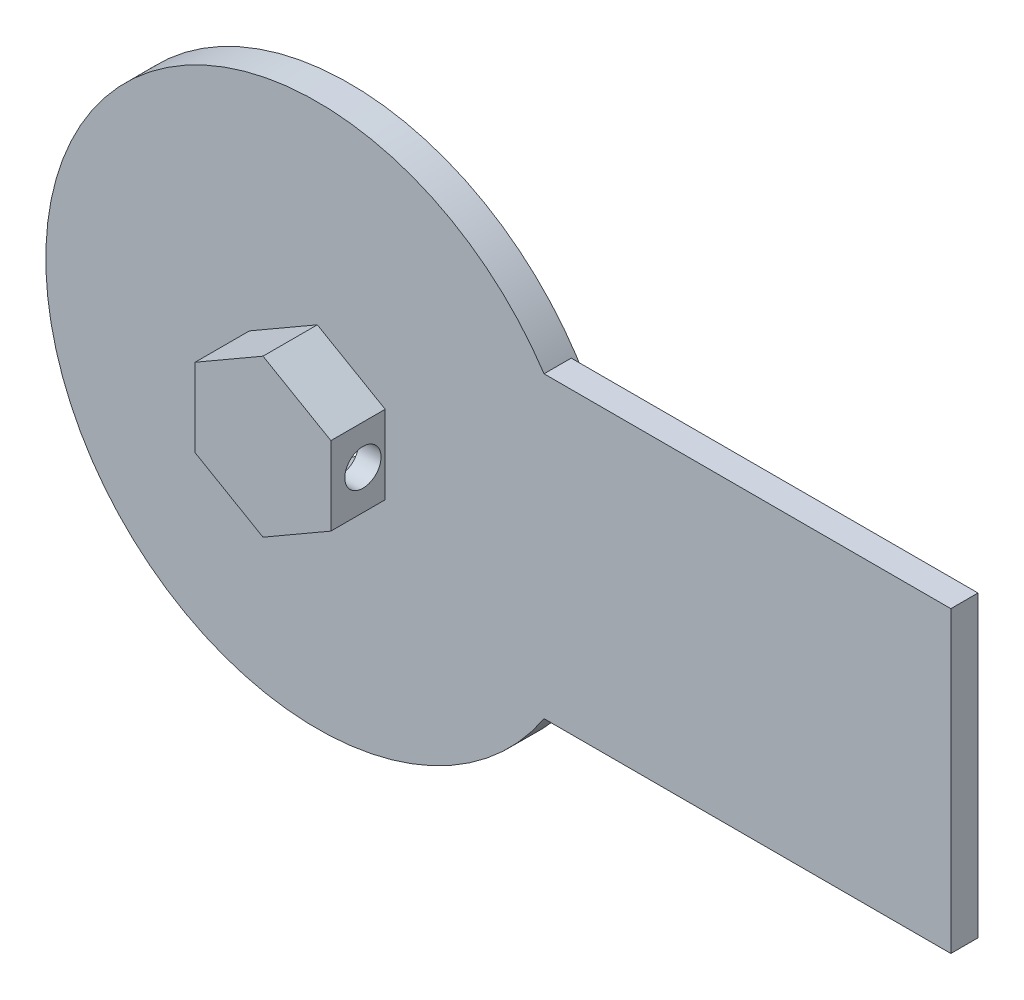
ISO-10303-21;
HEADER;
FILE_DESCRIPTION(('STEP AP214'),'2;1');
FILE_NAME('part.step','',(''),(''),'','','');
FILE_SCHEMA(('AUTOMOTIVE_DESIGN { 1 0 10303 214 1 1 1 1 }'));
ENDSEC;
DATA;
#1=APPLICATION_CONTEXT('core data for automotive mechanical design processes');
#2=APPLICATION_PROTOCOL_DEFINITION('international standard','automotive_design',2000,#1);
#3=PRODUCT_CONTEXT('',#1,'mechanical');
#4=PRODUCT('Part','Part','',(#3));
#5=PRODUCT_RELATED_PRODUCT_CATEGORY('part','',(#4));
#6=PRODUCT_DEFINITION_FORMATION('','',#4);
#7=PRODUCT_DEFINITION_CONTEXT('part definition',#1,'design');
#8=PRODUCT_DEFINITION('design','',#6,#7);
#9=PRODUCT_DEFINITION_SHAPE('','',#8);
#10=(LENGTH_UNIT() NAMED_UNIT(*) SI_UNIT(.MILLI.,.METRE.));
#11=(NAMED_UNIT(*) PLANE_ANGLE_UNIT() SI_UNIT($,.RADIAN.));
#12=(NAMED_UNIT(*) SI_UNIT($,.STERADIAN.) SOLID_ANGLE_UNIT());
#13=UNCERTAINTY_MEASURE_WITH_UNIT(LENGTH_MEASURE(1.E-05),#10,'distance_accuracy_value','');
#14=(GEOMETRIC_REPRESENTATION_CONTEXT(3) GLOBAL_UNCERTAINTY_ASSIGNED_CONTEXT((#13)) GLOBAL_UNIT_ASSIGNED_CONTEXT((#10,
#11,#12)) REPRESENTATION_CONTEXT('',''));
#15=CARTESIAN_POINT('',(0.,0.,0.));
#16=DIRECTION('',(0.,0.,1.));
#17=DIRECTION('',(1.,0.,0.));
#18=AXIS2_PLACEMENT_3D('',#15,#16,#17);
#19=CARTESIAN_POINT('',(-5.00000000000001,2.88675134594821,6.));
#20=DIRECTION('',(-0.499999999999995,0.866025403784441,0.));
#21=DIRECTION('',(-0.866025403784442,-0.499999999999995,0.));
#22=AXIS2_PLACEMENT_3D('',#19,#20,#21);
#23=PLANE('',#22);
#24=DIRECTION('',(-0.866025403784438,-0.500000000000001,0.));
#25=VECTOR('',#24,1.);
#26=CARTESIAN_POINT('',(0.,5.77350269189631,9.14));
#27=LINE('',#26,#25);
#28=CARTESIAN_POINT('',(0.,5.77350269189631,9.14));
#29=VERTEX_POINT('',#28);
#30=CARTESIAN_POINT('',(-5.00000000000001,2.88675134594821,9.14));
#31=VERTEX_POINT('',#30);
#32=EDGE_CURVE('E54',#29,#31,#27,.T.);
#33=ORIENTED_EDGE('',*,*,#32,.T.);
#34=DIRECTION('',(0.,0.,-1.));
#35=VECTOR('',#34,1.);
#36=CARTESIAN_POINT('',(-5.00000000000001,2.88675134594821,6.));
#37=LINE('',#36,#35);
#38=CARTESIAN_POINT('',(-5.00000000000001,2.88675134594821,0.));
#39=VERTEX_POINT('',#38);
#40=EDGE_CURVE('E244',#31,#39,#37,.T.);
#41=ORIENTED_EDGE('',*,*,#40,.T.);
#42=DIRECTION('',(0.866025403784442,0.499999999999995,0.));
#43=VECTOR('',#42,1.);
#44=CARTESIAN_POINT('',(-5.00000000000001,2.88675134594821,0.));
#45=LINE('',#44,#43);
#46=CARTESIAN_POINT('',(0.,5.77350269189631,0.));
#47=VERTEX_POINT('',#46);
#48=EDGE_CURVE('E229',#39,#47,#45,.T.);
#49=ORIENTED_EDGE('',*,*,#48,.T.);
#50=DIRECTION('',(0.,0.,-1.));
#51=VECTOR('',#50,1.);
#52=CARTESIAN_POINT('',(0.,5.77350269189631,6.));
#53=LINE('',#52,#51);
#54=EDGE_CURVE('E163',#29,#47,#53,.T.);
#55=ORIENTED_EDGE('',*,*,#54,.F.);
#56=EDGE_LOOP('',(#33,#41,#49,#55));
#57=FACE_BOUND('',#56,.T.);
#58=ADVANCED_FACE('F39',(#57),#23,.F.);
#59=CARTESIAN_POINT('',(-5.00000000000007,-2.88675134594811,6.));
#60=DIRECTION('',(-1.,0.,0.));
#61=DIRECTION('',(0.,-1.,0.));
#62=AXIS2_PLACEMENT_3D('',#59,#60,#61);
#63=PLANE('',#62);
#64=DIRECTION('',(0.,-1.,0.));
#65=VECTOR('',#64,1.);
#66=CARTESIAN_POINT('',(-5.00000000000005,2.88675134594814,9.14));
#67=LINE('',#66,#65);
#68=CARTESIAN_POINT('',(-5.00000000000007,-2.88675134594811,9.14));
#69=VERTEX_POINT('',#68);
#70=EDGE_CURVE('E61',#31,#69,#67,.T.);
#71=ORIENTED_EDGE('',*,*,#70,.T.);
#72=DIRECTION('',(0.,0.,-1.));
#73=VECTOR('',#72,1.);
#74=CARTESIAN_POINT('',(-5.00000000000007,-2.88675134594811,6.));
#75=LINE('',#74,#73);
#76=CARTESIAN_POINT('',(-5.00000000000007,-2.88675134594811,0.));
#77=VERTEX_POINT('',#76);
#78=EDGE_CURVE('E247',#69,#77,#75,.T.);
#79=ORIENTED_EDGE('',*,*,#78,.T.);
#80=DIRECTION('',(0.,1.,0.));
#81=VECTOR('',#80,1.);
#82=CARTESIAN_POINT('',(-5.00000000000007,-2.88675134594811,0.));
#83=LINE('',#82,#81);
#84=EDGE_CURVE('E241',#77,#39,#83,.T.);
#85=ORIENTED_EDGE('',*,*,#84,.T.);
#86=ORIENTED_EDGE('',*,*,#40,.F.);
#87=EDGE_LOOP('',(#71,#79,#85,#86));
#88=FACE_BOUND('',#87,.T.);
#89=ADVANCED_FACE('F311',(#88),#63,.F.);
#90=CARTESIAN_POINT('',(0.,-5.77350269189631,6.));
#91=DIRECTION('',(-0.500000000000007,-0.866025403784435,0.));
#92=DIRECTION('',(0.866025403784435,-0.500000000000007,0.));
#93=AXIS2_PLACEMENT_3D('',#90,#91,#92);
#94=PLANE('',#93);
#95=DIRECTION('',(0.866025403784442,-0.499999999999995,0.));
#96=VECTOR('',#95,1.);
#97=CARTESIAN_POINT('',(-5.00000000000003,-2.88675134594818,9.14));
#98=LINE('',#97,#96);
#99=CARTESIAN_POINT('',(0.,-5.77350269189631,9.14));
#100=VERTEX_POINT('',#99);
#101=EDGE_CURVE('E184',#69,#100,#98,.T.);
#102=ORIENTED_EDGE('',*,*,#101,.T.);
#103=DIRECTION('',(0.,0.,-1.));
#104=VECTOR('',#103,1.);
#105=CARTESIAN_POINT('',(0.,-5.77350269189631,6.));
#106=LINE('',#105,#104);
#107=CARTESIAN_POINT('',(0.,-5.77350269189631,0.));
#108=VERTEX_POINT('',#107);
#109=EDGE_CURVE('E249',#100,#108,#106,.T.);
#110=ORIENTED_EDGE('',*,*,#109,.T.);
#111=DIRECTION('',(-0.866025403784435,0.500000000000007,0.));
#112=VECTOR('',#111,1.);
#113=CARTESIAN_POINT('',(0.,-5.77350269189631,0.));
#114=LINE('',#113,#112);
#115=EDGE_CURVE('E238',#108,#77,#114,.T.);
#116=ORIENTED_EDGE('',*,*,#115,.T.);
#117=ORIENTED_EDGE('',*,*,#78,.F.);
#118=EDGE_LOOP('',(#102,#110,#116,#117));
#119=FACE_BOUND('',#118,.T.);
#120=ADVANCED_FACE('F316',(#119),#94,.F.);
#121=CARTESIAN_POINT('',(5.00000000000003,-2.88675134594818,6.));
#122=DIRECTION('',(0.499999999999995,-0.866025403784441,0.));
#123=DIRECTION('',(0.866025403784442,0.499999999999995,0.));
#124=AXIS2_PLACEMENT_3D('',#121,#122,#123);
#125=PLANE('',#124);
#126=DIRECTION('',(0.866025403784435,0.500000000000007,0.));
#127=VECTOR('',#126,1.);
#128=CARTESIAN_POINT('',(0.,-5.77350269189631,9.14));
#129=LINE('',#128,#127);
#130=CARTESIAN_POINT('',(5.00000000000003,-2.88675134594818,9.14));
#131=VERTEX_POINT('',#130);
#132=EDGE_CURVE('E172',#100,#131,#129,.T.);
#133=ORIENTED_EDGE('',*,*,#132,.T.);
#134=DIRECTION('',(0.,0.,-1.));
#135=VECTOR('',#134,1.);
#136=CARTESIAN_POINT('',(5.00000000000003,-2.88675134594818,6.));
#137=LINE('',#136,#135);
#138=CARTESIAN_POINT('',(5.00000000000003,-2.88675134594818,0.));
#139=VERTEX_POINT('',#138);
#140=EDGE_CURVE('E162',#131,#139,#137,.T.);
#141=ORIENTED_EDGE('',*,*,#140,.T.);
#142=DIRECTION('',(-0.866025403784442,-0.499999999999995,0.));
#143=VECTOR('',#142,1.);
#144=CARTESIAN_POINT('',(5.00000000000003,-2.88675134594818,0.));
#145=LINE('',#144,#143);
#146=EDGE_CURVE('E235',#139,#108,#145,.T.);
#147=ORIENTED_EDGE('',*,*,#146,.T.);
#148=ORIENTED_EDGE('',*,*,#109,.F.);
#149=EDGE_LOOP('',(#133,#141,#147,#148));
#150=FACE_BOUND('',#149,.T.);
#151=ADVANCED_FACE('F359',(#150),#125,.F.);
#152=CARTESIAN_POINT('',(5.00000000000005,2.88675134594814,6.));
#153=DIRECTION('',(1.,0.,0.));
#154=DIRECTION('',(0.,1.,0.));
#155=AXIS2_PLACEMENT_3D('',#152,#153,#154);
#156=PLANE('',#155);
#157=CARTESIAN_POINT('',(5.00000000000004,0.,6.));
#158=DIRECTION('',(1.,0.,0.));
#159=DIRECTION('',(0.,1.,0.));
#160=AXIS2_PLACEMENT_3D('',#157,#158,#159);
#161=CIRCLE('',#160,2.);
#162=CARTESIAN_POINT('',(5.00000000000005,2.,6.));
#163=VERTEX_POINT('',#162);
#164=EDGE_CURVE('E175',#163,#163,#161,.F.);
#165=ORIENTED_EDGE('',*,*,#164,.F.);
#166=EDGE_LOOP('',(#165));
#167=FACE_BOUND('',#166,.T.);
#168=DIRECTION('',(0.,1.,0.));
#169=VECTOR('',#168,1.);
#170=CARTESIAN_POINT('',(5.00000000000007,-2.88675134594811,9.14));
#171=LINE('',#170,#169);
#172=CARTESIAN_POINT('',(5.00000000000001,2.88675134594821,9.14));
#173=VERTEX_POINT('',#172);
#174=EDGE_CURVE('E167',#131,#173,#171,.T.);
#175=ORIENTED_EDGE('',*,*,#174,.T.);
#176=DIRECTION('',(0.,0.,-1.));
#177=VECTOR('',#176,1.);
#178=CARTESIAN_POINT('',(5.00000000000005,2.88675134594814,6.));
#179=LINE('',#178,#177);
#180=CARTESIAN_POINT('',(5.00000000000005,2.88675134594814,0.));
#181=VERTEX_POINT('',#180);
#182=EDGE_CURVE('E152',#173,#181,#179,.T.);
#183=ORIENTED_EDGE('',*,*,#182,.T.);
#184=DIRECTION('',(0.,-1.,0.));
#185=VECTOR('',#184,1.);
#186=CARTESIAN_POINT('',(5.00000000000005,2.88675134594814,0.));
#187=LINE('',#186,#185);
#188=EDGE_CURVE('E233',#181,#139,#187,.T.);
#189=ORIENTED_EDGE('',*,*,#188,.T.);
#190=ORIENTED_EDGE('',*,*,#140,.F.);
#191=EDGE_LOOP('',(#175,#183,#189,#190));
#192=FACE_BOUND('',#191,.T.);
#193=ADVANCED_FACE('F168',(#167,#192),#156,.F.);
#194=CARTESIAN_POINT('',(0.,5.77350269189631,6.));
#195=DIRECTION('',(0.500000000000001,0.866025403784438,0.));
#196=DIRECTION('',(-0.866025403784438,0.500000000000001,0.));
#197=AXIS2_PLACEMENT_3D('',#194,#195,#196);
#198=PLANE('',#197);
#199=DIRECTION('',(-0.866025403784442,0.499999999999995,0.));
#200=VECTOR('',#199,1.);
#201=CARTESIAN_POINT('',(5.00000000000001,2.88675134594821,9.14));
#202=LINE('',#201,#200);
#203=EDGE_CURVE('E156',#173,#29,#202,.T.);
#204=ORIENTED_EDGE('',*,*,#203,.T.);
#205=ORIENTED_EDGE('',*,*,#54,.T.);
#206=DIRECTION('',(0.866025403784438,-0.500000000000001,0.));
#207=VECTOR('',#206,1.);
#208=CARTESIAN_POINT('',(0.,5.77350269189631,0.));
#209=LINE('',#208,#207);
#210=EDGE_CURVE('E158',#47,#181,#209,.T.);
#211=ORIENTED_EDGE('',*,*,#210,.T.);
#212=ORIENTED_EDGE('',*,*,#182,.F.);
#213=EDGE_LOOP('',(#204,#205,#211,#212));
#214=FACE_BOUND('',#213,.T.);
#215=ADVANCED_FACE('F154',(#214),#198,.F.);
#216=CARTESIAN_POINT('',(0.,0.,3.54));
#217=DIRECTION('',(0.,0.,1.));
#218=DIRECTION('',(1.,0.,0.));
#219=AXIS2_PLACEMENT_3D('',#216,#217,#218);
#220=PLANE('',#219);
#221=CARTESIAN_POINT('',(0.,0.,3.54));
#222=DIRECTION('',(0.,0.,1.));
#223=DIRECTION('',(1.,0.,0.));
#224=AXIS2_PLACEMENT_3D('',#221,#222,#223);
#225=CIRCLE('',#224,30.);
#226=CARTESIAN_POINT('',(25.0549396327351,16.5,3.54));
#227=VERTEX_POINT('',#226);
#228=CARTESIAN_POINT('',(25.0549396327351,-16.5,3.54));
#229=VERTEX_POINT('',#228);
#230=EDGE_CURVE('E11',#227,#229,#225,.T.);
#231=ORIENTED_EDGE('',*,*,#230,.T.);
#232=DIRECTION('',(1.,0.,0.));
#233=VECTOR('',#232,1.);
#234=CARTESIAN_POINT('',(25.0549396327351,-16.5,3.54));
#235=LINE('',#234,#233);
#236=CARTESIAN_POINT('',(70.,-16.5,3.54));
#237=VERTEX_POINT('',#236);
#238=EDGE_CURVE('E246',#229,#237,#235,.T.);
#239=ORIENTED_EDGE('',*,*,#238,.T.);
#240=DIRECTION('',(0.,1.,0.));
#241=VECTOR('',#240,1.);
#242=CARTESIAN_POINT('',(70.,16.5,3.54));
#243=LINE('',#242,#241);
#244=CARTESIAN_POINT('',(70.,16.5,3.54));
#245=VERTEX_POINT('',#244);
#246=EDGE_CURVE('E269',#237,#245,#243,.T.);
#247=ORIENTED_EDGE('',*,*,#246,.T.);
#248=DIRECTION('',(-1.,0.,0.));
#249=VECTOR('',#248,1.);
#250=CARTESIAN_POINT('',(25.0549396327351,16.5,3.54));
#251=LINE('',#250,#249);
#252=EDGE_CURVE('E257',#245,#227,#251,.T.);
#253=ORIENTED_EDGE('',*,*,#252,.T.);
#254=EDGE_LOOP('',(#231,#239,#247,#253));
#255=FACE_BOUND('',#254,.T.);
#256=DIRECTION('',(-0.866025403784438,-0.5,0.));
#257=VECTOR('',#256,1.);
#258=CARTESIAN_POINT('',(0.,8.66025403784439,3.54));
#259=LINE('',#258,#257);
#260=CARTESIAN_POINT('',(0.,8.66025403784439,3.54));
#261=VERTEX_POINT('',#260);
#262=CARTESIAN_POINT('',(-7.5,4.33012701892219,3.54));
#263=VERTEX_POINT('',#262);
#264=EDGE_CURVE('E204',#261,#263,#259,.T.);
#265=ORIENTED_EDGE('',*,*,#264,.F.);
#266=DIRECTION('',(-0.866025403784439,0.5,0.));
#267=VECTOR('',#266,1.);
#268=CARTESIAN_POINT('',(7.5,4.3301270189222,3.54));
#269=LINE('',#268,#267);
#270=CARTESIAN_POINT('',(7.5,4.3301270189222,3.54));
#271=VERTEX_POINT('',#270);
#272=EDGE_CURVE('E171',#271,#261,#269,.T.);
#273=ORIENTED_EDGE('',*,*,#272,.F.);
#274=DIRECTION('',(0.,1.,0.));
#275=VECTOR('',#274,1.);
#276=CARTESIAN_POINT('',(7.5,-4.33012701892219,3.54));
#277=LINE('',#276,#275);
#278=CARTESIAN_POINT('',(7.5,-4.33012701892219,3.54));
#279=VERTEX_POINT('',#278);
#280=EDGE_CURVE('E191',#279,#271,#277,.T.);
#281=ORIENTED_EDGE('',*,*,#280,.F.);
#282=DIRECTION('',(0.866025403784439,0.5,0.));
#283=VECTOR('',#282,1.);
#284=CARTESIAN_POINT('',(0.,-8.66025403784439,3.54));
#285=LINE('',#284,#283);
#286=CARTESIAN_POINT('',(0.,-8.66025403784439,3.54));
#287=VERTEX_POINT('',#286);
#288=EDGE_CURVE('E210',#287,#279,#285,.T.);
#289=ORIENTED_EDGE('',*,*,#288,.F.);
#290=DIRECTION('',(0.866025403784439,-0.5,0.));
#291=VECTOR('',#290,1.);
#292=CARTESIAN_POINT('',(-7.50000000000001,-4.33012701892219,3.54));
#293=LINE('',#292,#291);
#294=CARTESIAN_POINT('',(-7.50000000000001,-4.33012701892219,3.54));
#295=VERTEX_POINT('',#294);
#296=EDGE_CURVE('E208',#295,#287,#293,.T.);
#297=ORIENTED_EDGE('',*,*,#296,.F.);
#298=DIRECTION('',(0.,-1.,0.));
#299=VECTOR('',#298,1.);
#300=CARTESIAN_POINT('',(-7.5,4.33012701892219,3.54));
#301=LINE('',#300,#299);
#302=EDGE_CURVE('E206',#263,#295,#301,.T.);
#303=ORIENTED_EDGE('',*,*,#302,.F.);
#304=EDGE_LOOP('',(#265,#273,#281,#289,#297,#303));
#305=FACE_BOUND('',#304,.T.);
#306=ADVANCED_FACE('F288',(#255,#305),#220,.T.);
#307=CARTESIAN_POINT('',(0.,0.,3.54));
#308=DIRECTION('',(0.,0.,-1.));
#309=DIRECTION('',(-1.,0.,0.));
#310=AXIS2_PLACEMENT_3D('',#307,#308,#309);
#311=CYLINDRICAL_SURFACE('',#310,30.);
#312=ORIENTED_EDGE('',*,*,#230,.F.);
#313=DIRECTION('',(0.,0.,1.));
#314=VECTOR('',#313,1.);
#315=CARTESIAN_POINT('',(25.0549396327351,16.5,0.54));
#316=LINE('',#315,#314);
#317=CARTESIAN_POINT('',(25.0549396327351,16.5,0.54));
#318=VERTEX_POINT('',#317);
#319=EDGE_CURVE('E273',#318,#227,#316,.T.);
#320=ORIENTED_EDGE('',*,*,#319,.F.);
#321=CARTESIAN_POINT('',(-2.74086309204336E-13,0.,0.54));
#322=DIRECTION('',(0.,0.,-1.));
#323=DIRECTION('',(-1.,0.,0.));
#324=AXIS2_PLACEMENT_3D('',#321,#322,#323);
#325=CIRCLE('',#324,30.0000000000002);
#326=CARTESIAN_POINT('',(25.0549396327351,-16.5,0.54));
#327=VERTEX_POINT('',#326);
#328=EDGE_CURVE('E253',#318,#327,#325,.T.);
#329=ORIENTED_EDGE('',*,*,#328,.T.);
#330=DIRECTION('',(0.,0.,1.));
#331=VECTOR('',#330,1.);
#332=CARTESIAN_POINT('',(25.0549396327351,-16.5,0.54));
#333=LINE('',#332,#331);
#334=EDGE_CURVE('E266',#327,#229,#333,.T.);
#335=ORIENTED_EDGE('',*,*,#334,.T.);
#336=EDGE_LOOP('',(#312,#320,#329,#335));
#337=FACE_BOUND('',#336,.T.);
#338=CARTESIAN_POINT('',(0.,0.,0.));
#339=DIRECTION('',(0.,0.,1.));
#340=DIRECTION('',(1.,0.,0.));
#341=AXIS2_PLACEMENT_3D('',#338,#339,#340);
#342=CIRCLE('',#341,30.);
#343=CARTESIAN_POINT('',(30.,0.,0.));
#344=VERTEX_POINT('',#343);
#345=EDGE_CURVE('E43',#344,#344,#342,.T.);
#346=ORIENTED_EDGE('',*,*,#345,.T.);
#347=EDGE_LOOP('',(#346));
#348=FACE_BOUND('',#347,.T.);
#349=ADVANCED_FACE('F41',(#337,#348),#311,.T.);
#350=CARTESIAN_POINT('',(0.,0.,0.));
#351=DIRECTION('',(0.,0.,1.));
#352=DIRECTION('',(1.,0.,0.));
#353=AXIS2_PLACEMENT_3D('',#350,#351,#352);
#354=PLANE('',#353);
#355=ORIENTED_EDGE('',*,*,#210,.F.);
#356=ORIENTED_EDGE('',*,*,#48,.F.);
#357=ORIENTED_EDGE('',*,*,#84,.F.);
#358=ORIENTED_EDGE('',*,*,#115,.F.);
#359=ORIENTED_EDGE('',*,*,#146,.F.);
#360=ORIENTED_EDGE('',*,*,#188,.F.);
#361=EDGE_LOOP('',(#355,#356,#357,#358,#359,#360));
#362=FACE_BOUND('',#361,.T.);
#363=ORIENTED_EDGE('',*,*,#345,.F.);
#364=EDGE_LOOP('',(#363));
#365=FACE_BOUND('',#364,.T.);
#366=ADVANCED_FACE('F308',(#362,#365),#354,.F.);
#367=CARTESIAN_POINT('',(25.0549396327351,16.5,0.54));
#368=DIRECTION('',(0.,1.,0.));
#369=DIRECTION('',(0.,0.,1.));
#370=AXIS2_PLACEMENT_3D('',#367,#368,#369);
#371=PLANE('',#370);
#372=ORIENTED_EDGE('',*,*,#252,.F.);
#373=DIRECTION('',(0.,0.,1.));
#374=VECTOR('',#373,1.);
#375=CARTESIAN_POINT('',(70.,16.5,0.54));
#376=LINE('',#375,#374);
#377=CARTESIAN_POINT('',(70.,16.5,0.54));
#378=VERTEX_POINT('',#377);
#379=EDGE_CURVE('E276',#378,#245,#376,.T.);
#380=ORIENTED_EDGE('',*,*,#379,.F.);
#381=DIRECTION('',(-1.,0.,0.));
#382=VECTOR('',#381,1.);
#383=CARTESIAN_POINT('',(25.0549396327351,16.5,0.54));
#384=LINE('',#383,#382);
#385=EDGE_CURVE('E263',#378,#318,#384,.T.);
#386=ORIENTED_EDGE('',*,*,#385,.T.);
#387=ORIENTED_EDGE('',*,*,#319,.T.);
#388=EDGE_LOOP('',(#372,#380,#386,#387));
#389=FACE_BOUND('',#388,.T.);
#390=ADVANCED_FACE('F293',(#389),#371,.T.);
#391=CARTESIAN_POINT('',(70.,16.5,0.54));
#392=DIRECTION('',(1.,0.,0.));
#393=DIRECTION('',(0.,0.,-1.));
#394=AXIS2_PLACEMENT_3D('',#391,#392,#393);
#395=PLANE('',#394);
#396=ORIENTED_EDGE('',*,*,#246,.F.);
#397=DIRECTION('',(0.,0.,1.));
#398=VECTOR('',#397,1.);
#399=CARTESIAN_POINT('',(70.,-16.5,0.54));
#400=LINE('',#399,#398);
#401=CARTESIAN_POINT('',(70.,-16.5,0.54));
#402=VERTEX_POINT('',#401);
#403=EDGE_CURVE('E278',#402,#237,#400,.T.);
#404=ORIENTED_EDGE('',*,*,#403,.F.);
#405=DIRECTION('',(0.,1.,0.));
#406=VECTOR('',#405,1.);
#407=CARTESIAN_POINT('',(70.,16.5,0.54));
#408=LINE('',#407,#406);
#409=EDGE_CURVE('E260',#402,#378,#408,.T.);
#410=ORIENTED_EDGE('',*,*,#409,.T.);
#411=ORIENTED_EDGE('',*,*,#379,.T.);
#412=EDGE_LOOP('',(#396,#404,#410,#411));
#413=FACE_BOUND('',#412,.T.);
#414=ADVANCED_FACE('F300',(#413),#395,.T.);
#415=CARTESIAN_POINT('',(25.0549396327351,-16.5,0.54));
#416=DIRECTION('',(0.,-1.,0.));
#417=DIRECTION('',(0.,0.,-1.));
#418=AXIS2_PLACEMENT_3D('',#415,#416,#417);
#419=PLANE('',#418);
#420=ORIENTED_EDGE('',*,*,#238,.F.);
#421=ORIENTED_EDGE('',*,*,#334,.F.);
#422=DIRECTION('',(1.,0.,0.));
#423=VECTOR('',#422,1.);
#424=CARTESIAN_POINT('',(25.0549396327351,-16.5,0.54));
#425=LINE('',#424,#423);
#426=EDGE_CURVE('E256',#327,#402,#425,.T.);
#427=ORIENTED_EDGE('',*,*,#426,.T.);
#428=ORIENTED_EDGE('',*,*,#403,.T.);
#429=EDGE_LOOP('',(#420,#421,#427,#428));
#430=FACE_BOUND('',#429,.T.);
#431=ADVANCED_FACE('F298',(#430),#419,.T.);
#432=CARTESIAN_POINT('',(-2.74086309204336E-13,0.,0.54));
#433=DIRECTION('',(0.,0.,-1.));
#434=DIRECTION('',(-1.,0.,0.));
#435=AXIS2_PLACEMENT_3D('',#432,#433,#434);
#436=PLANE('',#435);
#437=ORIENTED_EDGE('',*,*,#328,.F.);
#438=ORIENTED_EDGE('',*,*,#385,.F.);
#439=ORIENTED_EDGE('',*,*,#409,.F.);
#440=ORIENTED_EDGE('',*,*,#426,.F.);
#441=EDGE_LOOP('',(#437,#438,#439,#440));
#442=FACE_BOUND('',#441,.T.);
#443=ADVANCED_FACE('F297',(#442),#436,.T.);
#444=CARTESIAN_POINT('',(0.,0.,9.54));
#445=DIRECTION('',(0.,0.,1.));
#446=DIRECTION('',(1.,0.,0.));
#447=AXIS2_PLACEMENT_3D('',#444,#445,#446);
#448=PLANE('',#447);
#449=DIRECTION('',(-0.866025403784439,0.5,0.));
#450=VECTOR('',#449,1.);
#451=CARTESIAN_POINT('',(7.5,4.3301270189222,9.54));
#452=LINE('',#451,#450);
#453=CARTESIAN_POINT('',(7.5,4.3301270189222,9.54));
#454=VERTEX_POINT('',#453);
#455=CARTESIAN_POINT('',(0.,8.66025403784439,9.54));
#456=VERTEX_POINT('',#455);
#457=EDGE_CURVE('E187',#454,#456,#452,.T.);
#458=ORIENTED_EDGE('',*,*,#457,.T.);
#459=DIRECTION('',(-0.866025403784438,-0.5,0.));
#460=VECTOR('',#459,1.);
#461=CARTESIAN_POINT('',(0.,8.66025403784439,9.54));
#462=LINE('',#461,#460);
#463=CARTESIAN_POINT('',(-7.5,4.33012701892219,9.54));
#464=VERTEX_POINT('',#463);
#465=EDGE_CURVE('E190',#456,#464,#462,.T.);
#466=ORIENTED_EDGE('',*,*,#465,.T.);
#467=DIRECTION('',(0.,-1.,0.));
#468=VECTOR('',#467,1.);
#469=CARTESIAN_POINT('',(-7.5,4.33012701892219,9.54));
#470=LINE('',#469,#468);
#471=CARTESIAN_POINT('',(-7.50000000000001,-4.33012701892219,9.54));
#472=VERTEX_POINT('',#471);
#473=EDGE_CURVE('E193',#464,#472,#470,.T.);
#474=ORIENTED_EDGE('',*,*,#473,.T.);
#475=DIRECTION('',(0.866025403784439,-0.5,0.));
#476=VECTOR('',#475,1.);
#477=CARTESIAN_POINT('',(-7.50000000000001,-4.33012701892219,9.54));
#478=LINE('',#477,#476);
#479=CARTESIAN_POINT('',(0.,-8.66025403784439,9.54));
#480=VERTEX_POINT('',#479);
#481=EDGE_CURVE('E195',#472,#480,#478,.T.);
#482=ORIENTED_EDGE('',*,*,#481,.T.);
#483=DIRECTION('',(0.866025403784439,0.5,0.));
#484=VECTOR('',#483,1.);
#485=CARTESIAN_POINT('',(0.,-8.66025403784439,9.54));
#486=LINE('',#485,#484);
#487=CARTESIAN_POINT('',(7.5,-4.33012701892219,9.54));
#488=VERTEX_POINT('',#487);
#489=EDGE_CURVE('E197',#480,#488,#486,.T.);
#490=ORIENTED_EDGE('',*,*,#489,.T.);
#491=DIRECTION('',(0.,1.,0.));
#492=VECTOR('',#491,1.);
#493=CARTESIAN_POINT('',(7.5,-4.33012701892219,9.54));
#494=LINE('',#493,#492);
#495=EDGE_CURVE('E199',#488,#454,#494,.T.);
#496=ORIENTED_EDGE('',*,*,#495,.T.);
#497=EDGE_LOOP('',(#458,#466,#474,#482,#490,#496));
#498=FACE_BOUND('',#497,.T.);
#499=ADVANCED_FACE('F322',(#498),#448,.T.);
#500=CARTESIAN_POINT('',(7.5,4.3301270189222,9.54));
#501=DIRECTION('',(-0.5,-0.866025403784439,0.));
#502=DIRECTION('',(0.866025403784439,-0.5,0.));
#503=AXIS2_PLACEMENT_3D('',#500,#501,#502);
#504=PLANE('',#503);
#505=ORIENTED_EDGE('',*,*,#272,.T.);
#506=DIRECTION('',(0.,0.,-1.));
#507=VECTOR('',#506,1.);
#508=CARTESIAN_POINT('',(0.,8.66025403784439,9.54));
#509=LINE('',#508,#507);
#510=EDGE_CURVE('E227',#456,#261,#509,.T.);
#511=ORIENTED_EDGE('',*,*,#510,.F.);
#512=ORIENTED_EDGE('',*,*,#457,.F.);
#513=DIRECTION('',(0.,0.,-1.));
#514=VECTOR('',#513,1.);
#515=CARTESIAN_POINT('',(7.5,4.3301270189222,9.54));
#516=LINE('',#515,#514);
#517=EDGE_CURVE('E201',#454,#271,#516,.T.);
#518=ORIENTED_EDGE('',*,*,#517,.T.);
#519=EDGE_LOOP('',(#505,#511,#512,#518));
#520=FACE_BOUND('',#519,.T.);
#521=ADVANCED_FACE('F326',(#520),#504,.F.);
#522=CARTESIAN_POINT('',(0.,8.66025403784439,9.54));
#523=DIRECTION('',(0.5,-0.866025403784439,0.));
#524=DIRECTION('',(0.866025403784439,0.5,0.));
#525=AXIS2_PLACEMENT_3D('',#522,#523,#524);
#526=PLANE('',#525);
#527=ORIENTED_EDGE('',*,*,#264,.T.);
#528=DIRECTION('',(0.,0.,-1.));
#529=VECTOR('',#528,1.);
#530=CARTESIAN_POINT('',(-7.5,4.33012701892219,9.54));
#531=LINE('',#530,#529);
#532=EDGE_CURVE('E224',#464,#263,#531,.T.);
#533=ORIENTED_EDGE('',*,*,#532,.F.);
#534=ORIENTED_EDGE('',*,*,#465,.F.);
#535=ORIENTED_EDGE('',*,*,#510,.T.);
#536=EDGE_LOOP('',(#527,#533,#534,#535));
#537=FACE_BOUND('',#536,.T.);
#538=ADVANCED_FACE('F332',(#537),#526,.F.);
#539=CARTESIAN_POINT('',(-7.5,4.33012701892219,9.54));
#540=DIRECTION('',(1.,0.,0.));
#541=DIRECTION('',(0.,1.,0.));
#542=AXIS2_PLACEMENT_3D('',#539,#540,#541);
#543=PLANE('',#542);
#544=ORIENTED_EDGE('',*,*,#302,.T.);
#545=DIRECTION('',(0.,0.,-1.));
#546=VECTOR('',#545,1.);
#547=CARTESIAN_POINT('',(-7.50000000000001,-4.33012701892219,9.54));
#548=LINE('',#547,#546);
#549=EDGE_CURVE('E221',#472,#295,#548,.T.);
#550=ORIENTED_EDGE('',*,*,#549,.F.);
#551=ORIENTED_EDGE('',*,*,#473,.F.);
#552=ORIENTED_EDGE('',*,*,#532,.T.);
#553=EDGE_LOOP('',(#544,#550,#551,#552));
#554=FACE_BOUND('',#553,.T.);
#555=ADVANCED_FACE('F349',(#554),#543,.F.);
#556=CARTESIAN_POINT('',(-7.50000000000001,-4.33012701892219,9.54));
#557=DIRECTION('',(0.5,0.866025403784438,0.));
#558=DIRECTION('',(-0.866025403784439,0.5,0.));
#559=AXIS2_PLACEMENT_3D('',#556,#557,#558);
#560=PLANE('',#559);
#561=ORIENTED_EDGE('',*,*,#296,.T.);
#562=DIRECTION('',(0.,0.,-1.));
#563=VECTOR('',#562,1.);
#564=CARTESIAN_POINT('',(0.,-8.66025403784439,9.54));
#565=LINE('',#564,#563);
#566=EDGE_CURVE('E218',#480,#287,#565,.T.);
#567=ORIENTED_EDGE('',*,*,#566,.F.);
#568=ORIENTED_EDGE('',*,*,#481,.F.);
#569=ORIENTED_EDGE('',*,*,#549,.T.);
#570=EDGE_LOOP('',(#561,#567,#568,#569));
#571=FACE_BOUND('',#570,.T.);
#572=ADVANCED_FACE('F345',(#571),#560,.F.);
#573=CARTESIAN_POINT('',(0.,-8.66025403784439,9.54));
#574=DIRECTION('',(-0.5,0.866025403784439,0.));
#575=DIRECTION('',(-0.866025403784439,-0.5,0.));
#576=AXIS2_PLACEMENT_3D('',#573,#574,#575);
#577=PLANE('',#576);
#578=ORIENTED_EDGE('',*,*,#288,.T.);
#579=DIRECTION('',(0.,0.,-1.));
#580=VECTOR('',#579,1.);
#581=CARTESIAN_POINT('',(7.5,-4.33012701892219,9.54));
#582=LINE('',#581,#580);
#583=EDGE_CURVE('E216',#488,#279,#582,.T.);
#584=ORIENTED_EDGE('',*,*,#583,.F.);
#585=ORIENTED_EDGE('',*,*,#489,.F.);
#586=ORIENTED_EDGE('',*,*,#566,.T.);
#587=EDGE_LOOP('',(#578,#584,#585,#586));
#588=FACE_BOUND('',#587,.T.);
#589=ADVANCED_FACE('F341',(#588),#577,.F.);
#590=CARTESIAN_POINT('',(7.5,-4.33012701892219,9.54));
#591=DIRECTION('',(-1.,0.,0.));
#592=DIRECTION('',(0.,0.,1.));
#593=AXIS2_PLACEMENT_3D('',#590,#591,#592);
#594=PLANE('',#593);
#595=CARTESIAN_POINT('',(7.5,0.,6.));
#596=DIRECTION('',(1.,0.,0.));
#597=DIRECTION('',(0.,0.,-1.));
#598=AXIS2_PLACEMENT_3D('',#595,#596,#597);
#599=CIRCLE('',#598,2.);
#600=CARTESIAN_POINT('',(7.5,0.,4.));
#601=VERTEX_POINT('',#600);
#602=EDGE_CURVE('E179',#601,#601,#599,.T.);
#603=ORIENTED_EDGE('',*,*,#602,.F.);
#604=EDGE_LOOP('',(#603));
#605=FACE_BOUND('',#604,.T.);
#606=ORIENTED_EDGE('',*,*,#280,.T.);
#607=ORIENTED_EDGE('',*,*,#517,.F.);
#608=ORIENTED_EDGE('',*,*,#495,.F.);
#609=ORIENTED_EDGE('',*,*,#583,.T.);
#610=EDGE_LOOP('',(#606,#607,#608,#609));
#611=FACE_BOUND('',#610,.T.);
#612=ADVANCED_FACE('F338',(#605,#611),#594,.F.);
#613=CARTESIAN_POINT('',(0.,0.,9.14));
#614=DIRECTION('',(0.,0.,1.));
#615=DIRECTION('',(1.,0.,0.));
#616=AXIS2_PLACEMENT_3D('',#613,#614,#615);
#617=PLANE('',#616);
#618=ORIENTED_EDGE('',*,*,#203,.F.);
#619=ORIENTED_EDGE('',*,*,#174,.F.);
#620=ORIENTED_EDGE('',*,*,#132,.F.);
#621=ORIENTED_EDGE('',*,*,#101,.F.);
#622=ORIENTED_EDGE('',*,*,#70,.F.);
#623=ORIENTED_EDGE('',*,*,#32,.F.);
#624=EDGE_LOOP('',(#618,#619,#620,#621,#622,#623));
#625=FACE_BOUND('',#624,.T.);
#626=ADVANCED_FACE('F174',(#625),#617,.F.);
#627=CARTESIAN_POINT('',(-30.001,0.,6.));
#628=DIRECTION('',(1.,0.,0.));
#629=DIRECTION('',(0.,0.,-1.));
#630=AXIS2_PLACEMENT_3D('',#627,#628,#629);
#631=CYLINDRICAL_SURFACE('',#630,2.);
#632=ORIENTED_EDGE('',*,*,#602,.T.);
#633=EDGE_LOOP('',(#632));
#634=FACE_BOUND('',#633,.T.);
#635=ORIENTED_EDGE('',*,*,#164,.T.);
#636=EDGE_LOOP('',(#635));
#637=FACE_BOUND('',#636,.T.);
#638=ADVANCED_FACE('F370',(#634,#637),#631,.F.);
#639=CLOSED_SHELL('',(#58,#89,#120,#151,#193,#215,#306,#349,#366,#390,#414,#431,#443,#499,#521,
#538,#555,#572,#589,#612,#626,#638));
#640=MANIFOLD_SOLID_BREP('B2',#639);
#641=ADVANCED_BREP_SHAPE_REPRESENTATION('',(#18,#640),#14);
#642=SHAPE_DEFINITION_REPRESENTATION(#9,#641);
ENDSEC;
END-ISO-10303-21;
